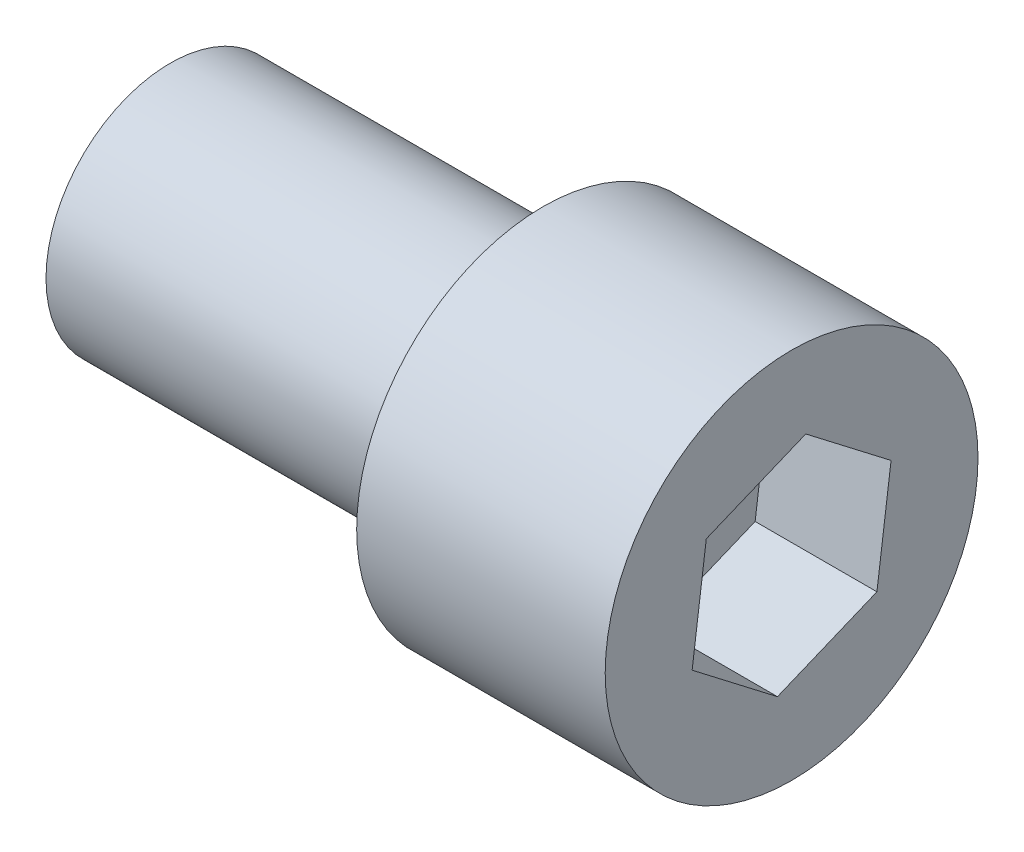
ISO-10303-21;
HEADER;
FILE_DESCRIPTION(('STEP AP214'),'2;1');
FILE_NAME('part.step','',(''),(''),'','','');
FILE_SCHEMA(('AUTOMOTIVE_DESIGN { 1 0 10303 214 1 1 1 1 }'));
ENDSEC;
DATA;
#1=APPLICATION_CONTEXT('core data for automotive mechanical design processes');
#2=APPLICATION_PROTOCOL_DEFINITION('international standard','automotive_design',2000,#1);
#3=PRODUCT_CONTEXT('',#1,'mechanical');
#4=PRODUCT('Part','Part','',(#3));
#5=PRODUCT_RELATED_PRODUCT_CATEGORY('part','',(#4));
#6=PRODUCT_DEFINITION_FORMATION('','',#4);
#7=PRODUCT_DEFINITION_CONTEXT('part definition',#1,'design');
#8=PRODUCT_DEFINITION('design','',#6,#7);
#9=PRODUCT_DEFINITION_SHAPE('','',#8);
#10=(LENGTH_UNIT() NAMED_UNIT(*) SI_UNIT(.MILLI.,.METRE.));
#11=(NAMED_UNIT(*) PLANE_ANGLE_UNIT() SI_UNIT($,.RADIAN.));
#12=(NAMED_UNIT(*) SI_UNIT($,.STERADIAN.) SOLID_ANGLE_UNIT());
#13=UNCERTAINTY_MEASURE_WITH_UNIT(LENGTH_MEASURE(1.E-05),#10,'distance_accuracy_value','');
#14=(GEOMETRIC_REPRESENTATION_CONTEXT(3) GLOBAL_UNCERTAINTY_ASSIGNED_CONTEXT((#13)) GLOBAL_UNIT_ASSIGNED_CONTEXT((#10,
#11,#12)) REPRESENTATION_CONTEXT('',''));
#15=CARTESIAN_POINT('',(0.,0.,0.));
#16=DIRECTION('',(0.,0.,1.));
#17=DIRECTION('',(1.,0.,0.));
#18=AXIS2_PLACEMENT_3D('',#15,#16,#17);
#19=CARTESIAN_POINT('',(485.902,30.5485465980299,5.80527144222161));
#20=DIRECTION('',(-1.,0.,0.));
#21=DIRECTION('',(0.,0.,1.));
#22=AXIS2_PLACEMENT_3D('',#19,#20,#21);
#23=PLANE('',#22);
#24=DIRECTION('',(0.,-0.991326635455262,0.131421085967781));
#25=VECTOR('',#24,1.);
#26=CARTESIAN_POINT('',(485.902,40.1998891860424,-5.08255254831092));
#27=LINE('',#26,#25);
#28=CARTESIAN_POINT('',(485.902,40.1998891860424,-5.08255254831092));
#29=VERTEX_POINT('',#28);
#30=CARTESIAN_POINT('',(485.902,34.7483249701146,-4.35983365440034));
#31=VERTEX_POINT('',#30);
#32=EDGE_CURVE('E72',#29,#31,#27,.T.);
#33=ORIENTED_EDGE('',*,*,#32,.F.);
#34=DIRECTION('',(0.,0.609477316768668,0.792803506768522));
#35=VECTOR('',#34,1.);
#36=CARTESIAN_POINT('',(485.902,40.1998891860424,-5.08255254831092));
#37=LINE('',#36,#35);
#38=CARTESIAN_POINT('',(485.902,43.5515642159278,-0.722718893910535));
#39=VERTEX_POINT('',#38);
#40=EDGE_CURVE('E119',#29,#39,#37,.T.);
#41=ORIENTED_EDGE('',*,*,#40,.T.);
#42=DIRECTION('',(0.,0.381849318686594,-0.924224592736302));
#43=VECTOR('',#42,1.);
#44=CARTESIAN_POINT('',(485.902,41.4516750298855,4.35983365440044));
#45=LINE('',#44,#43);
#46=CARTESIAN_POINT('',(485.902,41.4516750298855,4.35983365440045));
#47=VERTEX_POINT('',#46);
#48=EDGE_CURVE('E122',#47,#39,#45,.T.);
#49=ORIENTED_EDGE('',*,*,#48,.F.);
#50=DIRECTION('',(0.,0.991326635455262,-0.13142108596778));
#51=VECTOR('',#50,1.);
#52=CARTESIAN_POINT('',(485.902,36.0001108139577,5.08255254831103));
#53=LINE('',#52,#51);
#54=CARTESIAN_POINT('',(485.902,36.0001108139577,5.08255254831104));
#55=VERTEX_POINT('',#54);
#56=EDGE_CURVE('E127',#55,#47,#53,.T.);
#57=ORIENTED_EDGE('',*,*,#56,.F.);
#58=DIRECTION('',(0.,0.609477316768667,0.792803506768522));
#59=VECTOR('',#58,1.);
#60=CARTESIAN_POINT('',(485.902,32.6484357840722,0.722718893910634));
#61=LINE('',#60,#59);
#62=CARTESIAN_POINT('',(485.902,32.6484357840722,0.722718893910641));
#63=VERTEX_POINT('',#62);
#64=EDGE_CURVE('E82',#63,#55,#61,.T.);
#65=ORIENTED_EDGE('',*,*,#64,.F.);
#66=DIRECTION('',(0.,-0.381849318686594,0.924224592736302));
#67=VECTOR('',#66,1.);
#68=CARTESIAN_POINT('',(485.902,34.7483249701146,-4.35983365440034));
#69=LINE('',#68,#67);
#70=EDGE_CURVE('E67',#31,#63,#69,.T.);
#71=ORIENTED_EDGE('',*,*,#70,.F.);
#72=EDGE_LOOP('',(#33,#41,#49,#57,#65,#71));
#73=FACE_BOUND('',#72,.T.);
#74=ADVANCED_FACE('F16',(#73),#23,.F.);
#75=CARTESIAN_POINT('',(485.902,40.1998891860424,-5.08255254831092));
#76=DIRECTION('',(0.,0.131421085967781,0.991326635455262));
#77=DIRECTION('',(0.,-0.991326635455262,0.131421085967781));
#78=AXIS2_PLACEMENT_3D('',#75,#76,#77);
#79=PLANE('',#78);
#80=ORIENTED_EDGE('',*,*,#32,.T.);
#81=DIRECTION('',(1.,0.,0.));
#82=VECTOR('',#81,1.);
#83=CARTESIAN_POINT('',(485.902,34.7483249701146,-4.35983365440034));
#84=LINE('',#83,#82);
#85=CARTESIAN_POINT('',(492.125,34.7483249701146,-4.35983365440034));
#86=VERTEX_POINT('',#85);
#87=EDGE_CURVE('E74',#86,#31,#84,.F.);
#88=ORIENTED_EDGE('',*,*,#87,.F.);
#89=DIRECTION('',(0.,-0.991326635455261,0.131421085967782));
#90=VECTOR('',#89,1.);
#91=CARTESIAN_POINT('',(492.125,40.1998891860424,-5.08255254831093));
#92=LINE('',#91,#90);
#93=CARTESIAN_POINT('',(492.125,40.1998891860424,-5.08255254831093));
#94=VERTEX_POINT('',#93);
#95=EDGE_CURVE('E116',#94,#86,#92,.T.);
#96=ORIENTED_EDGE('',*,*,#95,.F.);
#97=DIRECTION('',(1.,0.,0.));
#98=VECTOR('',#97,1.);
#99=CARTESIAN_POINT('',(485.902,40.1998891860424,-5.08255254831093));
#100=LINE('',#99,#98);
#101=EDGE_CURVE('E77',#94,#29,#100,.F.);
#102=ORIENTED_EDGE('',*,*,#101,.T.);
#103=EDGE_LOOP('',(#80,#88,#96,#102));
#104=FACE_BOUND('',#103,.T.);
#105=ADVANCED_FACE('F73',(#104),#79,.T.);
#106=CARTESIAN_POINT('',(485.902,34.7483249701146,-4.35983365440034));
#107=DIRECTION('',(0.,0.924224592736302,0.381849318686594));
#108=DIRECTION('',(0.,-0.381849318686594,0.924224592736302));
#109=AXIS2_PLACEMENT_3D('',#106,#107,#108);
#110=PLANE('',#109);
#111=ORIENTED_EDGE('',*,*,#70,.T.);
#112=DIRECTION('',(1.,0.,0.));
#113=VECTOR('',#112,1.);
#114=CARTESIAN_POINT('',(485.902,32.6484357840722,0.722718893910632));
#115=LINE('',#114,#113);
#116=CARTESIAN_POINT('',(492.125,32.6484357840722,0.72271889391064));
#117=VERTEX_POINT('',#116);
#118=EDGE_CURVE('E84',#117,#63,#115,.F.);
#119=ORIENTED_EDGE('',*,*,#118,.F.);
#120=DIRECTION('',(0.,-0.381849318686601,0.924224592736299));
#121=VECTOR('',#120,1.);
#122=CARTESIAN_POINT('',(492.125,34.7483249701146,-4.35983365440034));
#123=LINE('',#122,#121);
#124=EDGE_CURVE('E88',#86,#117,#123,.T.);
#125=ORIENTED_EDGE('',*,*,#124,.F.);
#126=ORIENTED_EDGE('',*,*,#87,.T.);
#127=EDGE_LOOP('',(#111,#119,#125,#126));
#128=FACE_BOUND('',#127,.T.);
#129=ADVANCED_FACE('F86',(#128),#110,.T.);
#130=CARTESIAN_POINT('',(485.902,32.6484357840722,0.722718893910634));
#131=DIRECTION('',(0.,0.792803506768522,-0.609477316768667));
#132=DIRECTION('',(0.,0.609477316768667,0.792803506768522));
#133=AXIS2_PLACEMENT_3D('',#130,#131,#132);
#134=PLANE('',#133);
#135=ORIENTED_EDGE('',*,*,#64,.T.);
#136=DIRECTION('',(1.,0.,0.));
#137=VECTOR('',#136,1.);
#138=CARTESIAN_POINT('',(485.902,36.0001108139577,5.08255254831103));
#139=LINE('',#138,#137);
#140=CARTESIAN_POINT('',(492.125,36.0001108139577,5.08255254831103));
#141=VERTEX_POINT('',#140);
#142=EDGE_CURVE('E129',#141,#55,#139,.F.);
#143=ORIENTED_EDGE('',*,*,#142,.F.);
#144=DIRECTION('',(0.,0.609477316768672,0.792803506768518));
#145=VECTOR('',#144,1.);
#146=CARTESIAN_POINT('',(492.125,32.6484357840722,0.722718893910631));
#147=LINE('',#146,#145);
#148=EDGE_CURVE('E112',#117,#141,#147,.T.);
#149=ORIENTED_EDGE('',*,*,#148,.F.);
#150=ORIENTED_EDGE('',*,*,#118,.T.);
#151=EDGE_LOOP('',(#135,#143,#149,#150));
#152=FACE_BOUND('',#151,.T.);
#153=ADVANCED_FACE('F134',(#152),#134,.T.);
#154=CARTESIAN_POINT('',(485.902,36.0001108139577,5.08255254831103));
#155=DIRECTION('',(0.,-0.13142108596778,-0.991326635455262));
#156=DIRECTION('',(0.,0.991326635455262,-0.13142108596778));
#157=AXIS2_PLACEMENT_3D('',#154,#155,#156);
#158=PLANE('',#157);
#159=ORIENTED_EDGE('',*,*,#56,.T.);
#160=DIRECTION('',(1.,0.,0.));
#161=VECTOR('',#160,1.);
#162=CARTESIAN_POINT('',(485.902,41.4516750298855,4.35983365440044));
#163=LINE('',#162,#161);
#164=CARTESIAN_POINT('',(492.125,41.4516750298855,4.35983365440045));
#165=VERTEX_POINT('',#164);
#166=EDGE_CURVE('E124',#165,#47,#163,.F.);
#167=ORIENTED_EDGE('',*,*,#166,.F.);
#168=DIRECTION('',(0.,0.991326635455262,-0.131421085967781));
#169=VECTOR('',#168,1.);
#170=CARTESIAN_POINT('',(492.125,36.0001108139577,5.08255254831102));
#171=LINE('',#170,#169);
#172=EDGE_CURVE('E107',#141,#165,#171,.T.);
#173=ORIENTED_EDGE('',*,*,#172,.F.);
#174=ORIENTED_EDGE('',*,*,#142,.T.);
#175=EDGE_LOOP('',(#159,#167,#173,#174));
#176=FACE_BOUND('',#175,.T.);
#177=ADVANCED_FACE('F143',(#176),#158,.T.);
#178=CARTESIAN_POINT('',(485.902,41.4516750298855,4.35983365440044));
#179=DIRECTION('',(0.,-0.924224592736302,-0.381849318686594));
#180=DIRECTION('',(0.,0.381849318686594,-0.924224592736302));
#181=AXIS2_PLACEMENT_3D('',#178,#179,#180);
#182=PLANE('',#181);
#183=ORIENTED_EDGE('',*,*,#48,.T.);
#184=DIRECTION('',(1.,0.,0.));
#185=VECTOR('',#184,1.);
#186=CARTESIAN_POINT('',(485.902,43.5515642159278,-0.722718893910562));
#187=LINE('',#186,#185);
#188=CARTESIAN_POINT('',(492.125,43.5515642159278,-0.722718893910531));
#189=VERTEX_POINT('',#188);
#190=EDGE_CURVE('E34',#39,#189,#187,.T.);
#191=ORIENTED_EDGE('',*,*,#190,.T.);
#192=DIRECTION('',(0.,0.381849318686586,-0.924224592736306));
#193=VECTOR('',#192,1.);
#194=CARTESIAN_POINT('',(492.125,41.4516750298855,4.35983365440044));
#195=LINE('',#194,#193);
#196=EDGE_CURVE('E103',#165,#189,#195,.T.);
#197=ORIENTED_EDGE('',*,*,#196,.F.);
#198=ORIENTED_EDGE('',*,*,#166,.T.);
#199=EDGE_LOOP('',(#183,#191,#197,#198));
#200=FACE_BOUND('',#199,.T.);
#201=ADVANCED_FACE('F141',(#200),#182,.T.);
#202=CARTESIAN_POINT('',(485.902,40.1998891860424,-5.08255254831092));
#203=DIRECTION('',(0.,0.792803506768522,-0.609477316768668));
#204=DIRECTION('',(0.,0.609477316768668,0.792803506768522));
#205=AXIS2_PLACEMENT_3D('',#202,#203,#204);
#206=PLANE('',#205);
#207=ORIENTED_EDGE('',*,*,#190,.F.);
#208=ORIENTED_EDGE('',*,*,#40,.F.);
#209=ORIENTED_EDGE('',*,*,#101,.F.);
#210=DIRECTION('',(0.,-0.60947731676866,-0.792803506768528));
#211=VECTOR('',#210,1.);
#212=CARTESIAN_POINT('',(492.125,43.5515642159278,-0.722718893910534));
#213=LINE('',#212,#211);
#214=EDGE_CURVE('E99',#189,#94,#213,.T.);
#215=ORIENTED_EDGE('',*,*,#214,.F.);
#216=EDGE_LOOP('',(#207,#208,#209,#215));
#217=FACE_BOUND('',#216,.T.);
#218=ADVANCED_FACE('F139',(#217),#206,.F.);
#219=CARTESIAN_POINT('',(492.125,38.1,0.));
#220=DIRECTION('',(1.,0.,0.));
#221=DIRECTION('',(0.,0.,-1.));
#222=AXIS2_PLACEMENT_3D('',#219,#220,#221);
#223=PLANE('',#222);
#224=ORIENTED_EDGE('',*,*,#196,.T.);
#225=ORIENTED_EDGE('',*,*,#214,.T.);
#226=ORIENTED_EDGE('',*,*,#95,.T.);
#227=ORIENTED_EDGE('',*,*,#124,.T.);
#228=ORIENTED_EDGE('',*,*,#148,.T.);
#229=ORIENTED_EDGE('',*,*,#172,.T.);
#230=EDGE_LOOP('',(#224,#225,#226,#227,#228,#229));
#231=FACE_BOUND('',#230,.T.);
#232=CARTESIAN_POINT('',(492.125,38.1,0.));
#233=DIRECTION('',(1.,0.,0.));
#234=DIRECTION('',(0.,0.,-1.));
#235=AXIS2_PLACEMENT_3D('',#232,#233,#234);
#236=CIRCLE('',#235,9.525);
#237=CARTESIAN_POINT('',(492.125,38.1,-9.52499999999995));
#238=VERTEX_POINT('',#237);
#239=EDGE_CURVE('E19',#238,#238,#236,.F.);
#240=ORIENTED_EDGE('',*,*,#239,.F.);
#241=EDGE_LOOP('',(#240));
#242=FACE_BOUND('',#241,.T.);
#243=ADVANCED_FACE('F136',(#231,#242),#223,.T.);
#244=CARTESIAN_POINT('',(523.875,38.1,0.));
#245=DIRECTION('',(1.,0.,0.));
#246=DIRECTION('',(0.,0.,-1.));
#247=AXIS2_PLACEMENT_3D('',#244,#245,#246);
#248=CYLINDRICAL_SURFACE('',#247,9.525);
#249=CARTESIAN_POINT('',(479.425,38.1,0.));
#250=DIRECTION('',(1.,0.,0.));
#251=DIRECTION('',(0.,0.,-1.));
#252=AXIS2_PLACEMENT_3D('',#249,#250,#251);
#253=CIRCLE('',#252,9.525);
#254=CARTESIAN_POINT('',(479.425,38.1,-9.52499999999995));
#255=VERTEX_POINT('',#254);
#256=EDGE_CURVE('E94',#255,#255,#253,.F.);
#257=ORIENTED_EDGE('',*,*,#256,.F.);
#258=EDGE_LOOP('',(#257));
#259=FACE_BOUND('',#258,.T.);
#260=ORIENTED_EDGE('',*,*,#239,.T.);
#261=EDGE_LOOP('',(#260));
#262=FACE_BOUND('',#261,.T.);
#263=ADVANCED_FACE('F167',(#259,#262),#248,.T.);
#264=CARTESIAN_POINT('',(460.375,35.6752568263402,5.86882616387559));
#265=DIRECTION('',(-1.,0.,0.));
#266=DIRECTION('',(0.,0.,1.));
#267=AXIS2_PLACEMENT_3D('',#264,#265,#266);
#268=PLANE('',#267);
#269=CARTESIAN_POINT('',(460.375,38.1,0.));
#270=DIRECTION('',(1.,0.,0.));
#271=DIRECTION('',(0.,0.,-1.));
#272=AXIS2_PLACEMENT_3D('',#269,#270,#271);
#273=CIRCLE('',#272,6.35);
#274=CARTESIAN_POINT('',(460.375,38.1,-6.34999999999994));
#275=VERTEX_POINT('',#274);
#276=EDGE_CURVE('E25',#275,#275,#273,.T.);
#277=ORIENTED_EDGE('',*,*,#276,.F.);
#278=EDGE_LOOP('',(#277));
#279=FACE_BOUND('',#278,.T.);
#280=ADVANCED_FACE('F161',(#279),#268,.T.);
#281=CARTESIAN_POINT('',(479.425,34.4628852395102,8.80323924581334));
#282=DIRECTION('',(-1.,0.,0.));
#283=DIRECTION('',(0.,0.,1.));
#284=AXIS2_PLACEMENT_3D('',#281,#282,#283);
#285=PLANE('',#284);
#286=ORIENTED_EDGE('',*,*,#256,.T.);
#287=EDGE_LOOP('',(#286));
#288=FACE_BOUND('',#287,.T.);
#289=CARTESIAN_POINT('',(479.425,38.1,0.));
#290=DIRECTION('',(1.,0.,0.));
#291=DIRECTION('',(0.,0.,-1.));
#292=AXIS2_PLACEMENT_3D('',#289,#290,#291);
#293=CIRCLE('',#292,6.35);
#294=CARTESIAN_POINT('',(479.425,38.1,-6.34999999999995));
#295=VERTEX_POINT('',#294);
#296=EDGE_CURVE('E11',#295,#295,#293,.F.);
#297=ORIENTED_EDGE('',*,*,#296,.F.);
#298=EDGE_LOOP('',(#297));
#299=FACE_BOUND('',#298,.T.);
#300=ADVANCED_FACE('F155',(#288,#299),#285,.T.);
#301=CARTESIAN_POINT('',(523.875,38.1,0.));
#302=DIRECTION('',(1.,0.,0.));
#303=DIRECTION('',(0.,0.,-1.));
#304=AXIS2_PLACEMENT_3D('',#301,#302,#303);
#305=CYLINDRICAL_SURFACE('',#304,6.35);
#306=ORIENTED_EDGE('',*,*,#296,.T.);
#307=EDGE_LOOP('',(#306));
#308=FACE_BOUND('',#307,.T.);
#309=ORIENTED_EDGE('',*,*,#276,.T.);
#310=EDGE_LOOP('',(#309));
#311=FACE_BOUND('',#310,.T.);
#312=ADVANCED_FACE('F153',(#308,#311),#305,.T.);
#313=CLOSED_SHELL('',(#74,#105,#129,#153,#177,#201,#218,#243,#263,#280,#300,#312));
#314=MANIFOLD_SOLID_BREP('B1',#313);
#315=ADVANCED_BREP_SHAPE_REPRESENTATION('',(#18,#314),#14);
#316=SHAPE_DEFINITION_REPRESENTATION(#9,#315);
ENDSEC;
END-ISO-10303-21;
